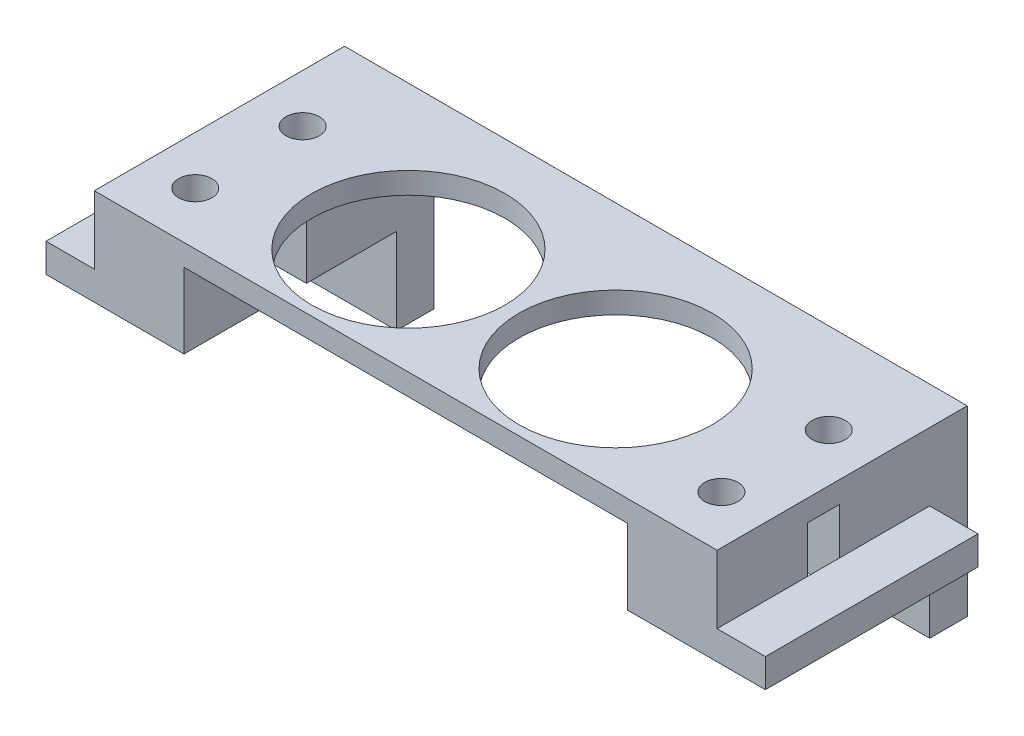
ISO-10303-21;
HEADER;
FILE_DESCRIPTION(('STEP AP214'),'2;1');
FILE_NAME('part.step','',(''),(''),'','','');
FILE_SCHEMA(('AUTOMOTIVE_DESIGN { 1 0 10303 214 1 1 1 1 }'));
ENDSEC;
DATA;
#1=APPLICATION_CONTEXT('core data for automotive mechanical design processes');
#2=APPLICATION_PROTOCOL_DEFINITION('international standard','automotive_design',2000,#1);
#3=PRODUCT_CONTEXT('',#1,'mechanical');
#4=PRODUCT('Part','Part','',(#3));
#5=PRODUCT_RELATED_PRODUCT_CATEGORY('part','',(#4));
#6=PRODUCT_DEFINITION_FORMATION('','',#4);
#7=PRODUCT_DEFINITION_CONTEXT('part definition',#1,'design');
#8=PRODUCT_DEFINITION('design','',#6,#7);
#9=PRODUCT_DEFINITION_SHAPE('','',#8);
#10=(LENGTH_UNIT() NAMED_UNIT(*) SI_UNIT(.MILLI.,.METRE.));
#11=(NAMED_UNIT(*) PLANE_ANGLE_UNIT() SI_UNIT($,.RADIAN.));
#12=(NAMED_UNIT(*) SI_UNIT($,.STERADIAN.) SOLID_ANGLE_UNIT());
#13=UNCERTAINTY_MEASURE_WITH_UNIT(LENGTH_MEASURE(1.E-05),#10,'distance_accuracy_value','');
#14=(GEOMETRIC_REPRESENTATION_CONTEXT(3) GLOBAL_UNCERTAINTY_ASSIGNED_CONTEXT((#13)) GLOBAL_UNIT_ASSIGNED_CONTEXT((#10,
#11,#12)) REPRESENTATION_CONTEXT('',''));
#15=CARTESIAN_POINT('',(0.,0.,0.));
#16=DIRECTION('',(0.,0.,1.));
#17=DIRECTION('',(1.,0.,0.));
#18=AXIS2_PLACEMENT_3D('',#15,#16,#17);
#19=CARTESIAN_POINT('',(-29.,2.,0.));
#20=DIRECTION('',(1.,0.,0.));
#21=DIRECTION('',(0.,0.,-1.));
#22=AXIS2_PLACEMENT_3D('',#19,#20,#21);
#23=PLANE('',#22);
#24=DIRECTION('',(0.,-1.,0.));
#25=VECTOR('',#24,1.);
#26=CARTESIAN_POINT('',(-29.,-4.325,-9.9));
#27=LINE('',#26,#25);
#28=CARTESIAN_POINT('',(-29.,-4.325,-9.9));
#29=VERTEX_POINT('',#28);
#30=CARTESIAN_POINT('',(-29.,-7.,-9.9));
#31=VERTEX_POINT('',#30);
#32=EDGE_CURVE('E248',#29,#31,#27,.T.);
#33=ORIENTED_EDGE('',*,*,#32,.F.);
#34=DIRECTION('',(0.,0.,1.));
#35=VECTOR('',#34,1.);
#36=CARTESIAN_POINT('',(-29.,-4.325,9.9));
#37=LINE('',#36,#35);
#38=CARTESIAN_POINT('',(-29.,-4.325,-1.5));
#39=VERTEX_POINT('',#38);
#40=EDGE_CURVE('E48',#29,#39,#37,.T.);
#41=ORIENTED_EDGE('',*,*,#40,.T.);
#42=DIRECTION('',(0.,1.,0.));
#43=VECTOR('',#42,1.);
#44=CARTESIAN_POINT('',(-29.,-7.,-1.5));
#45=LINE('',#44,#43);
#46=CARTESIAN_POINT('',(-29.,0.,-1.5));
#47=VERTEX_POINT('',#46);
#48=EDGE_CURVE('E398',#39,#47,#45,.T.);
#49=ORIENTED_EDGE('',*,*,#48,.T.);
#50=DIRECTION('',(0.,0.,1.));
#51=VECTOR('',#50,1.);
#52=CARTESIAN_POINT('',(-29.,0.,0.));
#53=LINE('',#52,#51);
#54=CARTESIAN_POINT('',(-29.,0.,1.5));
#55=VERTEX_POINT('',#54);
#56=EDGE_CURVE('E462',#47,#55,#53,.T.);
#57=ORIENTED_EDGE('',*,*,#56,.T.);
#58=DIRECTION('',(0.,1.,0.));
#59=VECTOR('',#58,1.);
#60=CARTESIAN_POINT('',(-29.,-7.,1.5));
#61=LINE('',#60,#59);
#62=CARTESIAN_POINT('',(-29.,-4.325,1.50000000000001));
#63=VERTEX_POINT('',#62);
#64=EDGE_CURVE('E422',#63,#55,#61,.T.);
#65=ORIENTED_EDGE('',*,*,#64,.F.);
#66=CARTESIAN_POINT('',(-29.,-4.325,9.9));
#67=VERTEX_POINT('',#66);
#68=EDGE_CURVE('E11',#63,#67,#37,.T.);
#69=ORIENTED_EDGE('',*,*,#68,.T.);
#70=DIRECTION('',(0.,-1.,0.));
#71=VECTOR('',#70,1.);
#72=CARTESIAN_POINT('',(-29.,2.,9.9));
#73=LINE('',#72,#71);
#74=CARTESIAN_POINT('',(-29.,2.,9.9));
#75=VERTEX_POINT('',#74);
#76=EDGE_CURVE('E41',#75,#67,#73,.T.);
#77=ORIENTED_EDGE('',*,*,#76,.F.);
#78=DIRECTION('',(0.,0.,1.));
#79=VECTOR('',#78,1.);
#80=CARTESIAN_POINT('',(-29.,2.,0.));
#81=LINE('',#80,#79);
#82=CARTESIAN_POINT('',(-29.,2.,-13.4));
#83=VERTEX_POINT('',#82);
#84=EDGE_CURVE('E448',#83,#75,#81,.T.);
#85=ORIENTED_EDGE('',*,*,#84,.F.);
#86=DIRECTION('',(0.,1.,0.));
#87=VECTOR('',#86,1.);
#88=CARTESIAN_POINT('',(-29.,-58.1055074842308,-13.4));
#89=LINE('',#88,#87);
#90=CARTESIAN_POINT('',(-29.,-15.,-13.4));
#91=VERTEX_POINT('',#90);
#92=EDGE_CURVE('E327',#91,#83,#89,.T.);
#93=ORIENTED_EDGE('',*,*,#92,.F.);
#94=DIRECTION('',(0.,0.,-1.));
#95=VECTOR('',#94,1.);
#96=CARTESIAN_POINT('',(-29.,-15.,0.));
#97=LINE('',#96,#95);
#98=CARTESIAN_POINT('',(-29.,-15.,-9.9));
#99=VERTEX_POINT('',#98);
#100=EDGE_CURVE('E290',#99,#91,#97,.T.);
#101=ORIENTED_EDGE('',*,*,#100,.F.);
#102=DIRECTION('',(0.,1.,0.));
#103=VECTOR('',#102,1.);
#104=CARTESIAN_POINT('',(-29.,-15.,-9.9));
#105=LINE('',#104,#103);
#106=EDGE_CURVE('E294',#99,#31,#105,.T.);
#107=ORIENTED_EDGE('',*,*,#106,.T.);
#108=EDGE_LOOP('',(#33,#41,#49,#57,#65,#69,#77,#85,#93,#101,#107));
#109=FACE_BOUND('',#108,.T.);
#110=ADVANCED_FACE('F37',(#109),#23,.F.);
#111=CARTESIAN_POINT('',(29.,2.,0.));
#112=DIRECTION('',(1.,0.,0.));
#113=DIRECTION('',(0.,0.,-1.));
#114=AXIS2_PLACEMENT_3D('',#111,#112,#113);
#115=PLANE('',#114);
#116=DIRECTION('',(0.,-1.,0.));
#117=VECTOR('',#116,1.);
#118=CARTESIAN_POINT('',(29.,2.,9.9));
#119=LINE('',#118,#117);
#120=CARTESIAN_POINT('',(29.,2.,9.9));
#121=VERTEX_POINT('',#120);
#122=CARTESIAN_POINT('',(29.,-4.325,9.9));
#123=VERTEX_POINT('',#122);
#124=EDGE_CURVE('E453',#121,#123,#119,.T.);
#125=ORIENTED_EDGE('',*,*,#124,.T.);
#126=DIRECTION('',(0.,0.,-1.));
#127=VECTOR('',#126,1.);
#128=CARTESIAN_POINT('',(29.,-4.325,9.9));
#129=LINE('',#128,#127);
#130=CARTESIAN_POINT('',(29.,-4.325,1.5));
#131=VERTEX_POINT('',#130);
#132=EDGE_CURVE('E252',#123,#131,#129,.T.);
#133=ORIENTED_EDGE('',*,*,#132,.T.);
#134=DIRECTION('',(0.,1.,0.));
#135=VECTOR('',#134,1.);
#136=CARTESIAN_POINT('',(29.,-7.,1.5));
#137=LINE('',#136,#135);
#138=CARTESIAN_POINT('',(29.,0.,1.5));
#139=VERTEX_POINT('',#138);
#140=EDGE_CURVE('E373',#131,#139,#137,.T.);
#141=ORIENTED_EDGE('',*,*,#140,.T.);
#142=DIRECTION('',(0.,0.,1.));
#143=VECTOR('',#142,1.);
#144=CARTESIAN_POINT('',(29.,0.,0.));
#145=LINE('',#144,#143);
#146=CARTESIAN_POINT('',(29.,0.,-1.5));
#147=VERTEX_POINT('',#146);
#148=EDGE_CURVE('E459',#147,#139,#145,.T.);
#149=ORIENTED_EDGE('',*,*,#148,.F.);
#150=DIRECTION('',(0.,1.,0.));
#151=VECTOR('',#150,1.);
#152=CARTESIAN_POINT('',(29.,-7.,-1.5));
#153=LINE('',#152,#151);
#154=CARTESIAN_POINT('',(29.,-4.325,-1.49999999999999));
#155=VERTEX_POINT('',#154);
#156=EDGE_CURVE('E344',#155,#147,#153,.T.);
#157=ORIENTED_EDGE('',*,*,#156,.F.);
#158=CARTESIAN_POINT('',(29.,-4.325,-9.9));
#159=VERTEX_POINT('',#158);
#160=EDGE_CURVE('E46',#155,#159,#129,.T.);
#161=ORIENTED_EDGE('',*,*,#160,.T.);
#162=DIRECTION('',(0.,-1.,0.));
#163=VECTOR('',#162,1.);
#164=CARTESIAN_POINT('',(29.,-4.325,-9.9));
#165=LINE('',#164,#163);
#166=CARTESIAN_POINT('',(29.,-7.,-9.9));
#167=VERTEX_POINT('',#166);
#168=EDGE_CURVE('E265',#159,#167,#165,.T.);
#169=ORIENTED_EDGE('',*,*,#168,.T.);
#170=DIRECTION('',(0.,1.,0.));
#171=VECTOR('',#170,1.);
#172=CARTESIAN_POINT('',(29.,-15.,-9.9));
#173=LINE('',#172,#171);
#174=CARTESIAN_POINT('',(29.,-15.,-9.9));
#175=VERTEX_POINT('',#174);
#176=EDGE_CURVE('E316',#175,#167,#173,.T.);
#177=ORIENTED_EDGE('',*,*,#176,.F.);
#178=DIRECTION('',(0.,0.,-1.));
#179=VECTOR('',#178,1.);
#180=CARTESIAN_POINT('',(29.,-15.,0.));
#181=LINE('',#180,#179);
#182=CARTESIAN_POINT('',(29.,-15.,-13.4));
#183=VERTEX_POINT('',#182);
#184=EDGE_CURVE('E305',#175,#183,#181,.T.);
#185=ORIENTED_EDGE('',*,*,#184,.T.);
#186=DIRECTION('',(0.,1.,0.));
#187=VECTOR('',#186,1.);
#188=CARTESIAN_POINT('',(29.,-58.1055074842308,-13.4));
#189=LINE('',#188,#187);
#190=CARTESIAN_POINT('',(29.,2.,-13.4));
#191=VERTEX_POINT('',#190);
#192=EDGE_CURVE('E325',#183,#191,#189,.T.);
#193=ORIENTED_EDGE('',*,*,#192,.T.);
#194=DIRECTION('',(0.,0.,1.));
#195=VECTOR('',#194,1.);
#196=CARTESIAN_POINT('',(29.,2.,0.));
#197=LINE('',#196,#195);
#198=EDGE_CURVE('E446',#191,#121,#197,.T.);
#199=ORIENTED_EDGE('',*,*,#198,.T.);
#200=EDGE_LOOP('',(#125,#133,#141,#149,#157,#161,#169,#177,#185,#193,#199));
#201=FACE_BOUND('',#200,.T.);
#202=ADVANCED_FACE('F477',(#201),#115,.T.);
#203=CARTESIAN_POINT('',(0.,0.,0.));
#204=DIRECTION('',(0.,1.,0.));
#205=DIRECTION('',(0.,0.,1.));
#206=AXIS2_PLACEMENT_3D('',#203,#204,#205);
#207=PLANE('',#206);
#208=CARTESIAN_POINT('',(9.65,0.,0.));
#209=DIRECTION('',(0.,1.,0.));
#210=DIRECTION('',(0.,0.,1.));
#211=AXIS2_PLACEMENT_3D('',#208,#209,#210);
#212=CIRCLE('',#211,9.);
#213=CARTESIAN_POINT('',(9.65,0.,9.));
#214=VERTEX_POINT('',#213);
#215=EDGE_CURVE('E426',#214,#214,#212,.T.);
#216=ORIENTED_EDGE('',*,*,#215,.T.);
#217=EDGE_LOOP('',(#216));
#218=FACE_BOUND('',#217,.T.);
#219=CARTESIAN_POINT('',(-9.65,0.,0.));
#220=DIRECTION('',(0.,1.,0.));
#221=DIRECTION('',(0.,0.,1.));
#222=AXIS2_PLACEMENT_3D('',#219,#220,#221);
#223=CIRCLE('',#222,9.);
#224=CARTESIAN_POINT('',(-9.65,0.,9.));
#225=VERTEX_POINT('',#224);
#226=EDGE_CURVE('E456',#225,#225,#223,.T.);
#227=ORIENTED_EDGE('',*,*,#226,.T.);
#228=EDGE_LOOP('',(#227));
#229=FACE_BOUND('',#228,.T.);
#230=DIRECTION('',(0.,0.,-1.));
#231=VECTOR('',#230,1.);
#232=CARTESIAN_POINT('',(-20.65,0.,0.));
#233=LINE('',#232,#231);
#234=CARTESIAN_POINT('',(-20.65,0.,-1.5));
#235=VERTEX_POINT('',#234);
#236=CARTESIAN_POINT('',(-20.65,0.,-13.4));
#237=VERTEX_POINT('',#236);
#238=EDGE_CURVE('E384',#235,#237,#233,.T.);
#239=ORIENTED_EDGE('',*,*,#238,.T.);
#240=DIRECTION('',(1.,0.,0.));
#241=VECTOR('',#240,1.);
#242=CARTESIAN_POINT('',(0.,0.,-13.4));
#243=LINE('',#242,#241);
#244=CARTESIAN_POINT('',(20.65,0.,-13.4));
#245=VERTEX_POINT('',#244);
#246=EDGE_CURVE('E321',#237,#245,#243,.T.);
#247=ORIENTED_EDGE('',*,*,#246,.T.);
#248=DIRECTION('',(0.,0.,-1.));
#249=VECTOR('',#248,1.);
#250=CARTESIAN_POINT('',(20.65,0.,0.));
#251=LINE('',#250,#249);
#252=CARTESIAN_POINT('',(20.65,0.,-1.5));
#253=VERTEX_POINT('',#252);
#254=EDGE_CURVE('E335',#253,#245,#251,.T.);
#255=ORIENTED_EDGE('',*,*,#254,.F.);
#256=DIRECTION('',(1.,0.,0.));
#257=VECTOR('',#256,1.);
#258=CARTESIAN_POINT('',(0.,0.,-1.5));
#259=LINE('',#258,#257);
#260=EDGE_CURVE('E324',#253,#147,#259,.T.);
#261=ORIENTED_EDGE('',*,*,#260,.T.);
#262=ORIENTED_EDGE('',*,*,#148,.T.);
#263=DIRECTION('',(1.,0.,0.));
#264=VECTOR('',#263,1.);
#265=CARTESIAN_POINT('',(0.,0.,1.5));
#266=LINE('',#265,#264);
#267=CARTESIAN_POINT('',(20.65,0.,1.5));
#268=VERTEX_POINT('',#267);
#269=EDGE_CURVE('E359',#268,#139,#266,.T.);
#270=ORIENTED_EDGE('',*,*,#269,.F.);
#271=DIRECTION('',(0.,0.,-1.));
#272=VECTOR('',#271,1.);
#273=CARTESIAN_POINT('',(20.65,0.,0.));
#274=LINE('',#273,#272);
#275=CARTESIAN_POINT('',(20.65,0.,9.9));
#276=VERTEX_POINT('',#275);
#277=EDGE_CURVE('E354',#276,#268,#274,.T.);
#278=ORIENTED_EDGE('',*,*,#277,.F.);
#279=DIRECTION('',(1.,0.,0.));
#280=VECTOR('',#279,1.);
#281=CARTESIAN_POINT('',(0.,0.,9.9));
#282=LINE('',#281,#280);
#283=CARTESIAN_POINT('',(-20.65,0.,9.9));
#284=VERTEX_POINT('',#283);
#285=EDGE_CURVE('E431',#284,#276,#282,.T.);
#286=ORIENTED_EDGE('',*,*,#285,.F.);
#287=DIRECTION('',(0.,0.,-1.));
#288=VECTOR('',#287,1.);
#289=CARTESIAN_POINT('',(-20.65,0.,0.));
#290=LINE('',#289,#288);
#291=CARTESIAN_POINT('',(-20.65,0.,1.5));
#292=VERTEX_POINT('',#291);
#293=EDGE_CURVE('E406',#284,#292,#290,.T.);
#294=ORIENTED_EDGE('',*,*,#293,.T.);
#295=DIRECTION('',(1.,0.,0.));
#296=VECTOR('',#295,1.);
#297=CARTESIAN_POINT('',(0.,0.,1.5));
#298=LINE('',#297,#296);
#299=EDGE_CURVE('E401',#55,#292,#298,.T.);
#300=ORIENTED_EDGE('',*,*,#299,.F.);
#301=ORIENTED_EDGE('',*,*,#56,.F.);
#302=DIRECTION('',(1.,0.,0.));
#303=VECTOR('',#302,1.);
#304=CARTESIAN_POINT('',(0.,0.,-1.5));
#305=LINE('',#304,#303);
#306=EDGE_CURVE('E379',#47,#235,#305,.T.);
#307=ORIENTED_EDGE('',*,*,#306,.T.);
#308=EDGE_LOOP('',(#239,#247,#255,#261,#262,#270,#278,#286,#294,#300,#301,#307));
#309=FACE_BOUND('',#308,.T.);
#310=ADVANCED_FACE('F493',(#218,#229,#309),#207,.F.);
#311=CARTESIAN_POINT('',(-9.65,2.,0.));
#312=DIRECTION('',(0.,-1.,0.));
#313=DIRECTION('',(0.,0.,-1.));
#314=AXIS2_PLACEMENT_3D('',#311,#312,#313);
#315=CYLINDRICAL_SURFACE('',#314,9.);
#316=CARTESIAN_POINT('',(-9.65,2.,0.));
#317=DIRECTION('',(0.,1.,0.));
#318=DIRECTION('',(0.,0.,1.));
#319=AXIS2_PLACEMENT_3D('',#316,#317,#318);
#320=CIRCLE('',#319,9.);
#321=CARTESIAN_POINT('',(-9.65,2.,9.));
#322=VERTEX_POINT('',#321);
#323=EDGE_CURVE('E443',#322,#322,#320,.T.);
#324=ORIENTED_EDGE('',*,*,#323,.T.);
#325=EDGE_LOOP('',(#324));
#326=FACE_BOUND('',#325,.T.);
#327=ORIENTED_EDGE('',*,*,#226,.F.);
#328=EDGE_LOOP('',(#327));
#329=FACE_BOUND('',#328,.T.);
#330=ADVANCED_FACE('F546',(#326,#329),#315,.F.);
#331=CARTESIAN_POINT('',(-24.5,2.,-5.));
#332=DIRECTION('',(0.,-1.,0.));
#333=DIRECTION('',(0.,0.,-1.));
#334=AXIS2_PLACEMENT_3D('',#331,#332,#333);
#335=CYLINDRICAL_SURFACE('',#334,1.55);
#336=CARTESIAN_POINT('',(-24.5,2.,-5.));
#337=DIRECTION('',(0.,1.,0.));
#338=DIRECTION('',(0.,0.,1.));
#339=AXIS2_PLACEMENT_3D('',#336,#337,#338);
#340=CIRCLE('',#339,1.55);
#341=CARTESIAN_POINT('',(-24.5,2.,-3.45));
#342=VERTEX_POINT('',#341);
#343=EDGE_CURVE('E440',#342,#342,#340,.T.);
#344=ORIENTED_EDGE('',*,*,#343,.T.);
#345=EDGE_LOOP('',(#344));
#346=FACE_BOUND('',#345,.T.);
#347=CARTESIAN_POINT('',(-24.5,-7.,-5.));
#348=DIRECTION('',(0.,-1.,0.));
#349=DIRECTION('',(0.,0.,-1.));
#350=AXIS2_PLACEMENT_3D('',#347,#348,#349);
#351=CIRCLE('',#350,1.55);
#352=CARTESIAN_POINT('',(-24.5,-7.,-6.55));
#353=VERTEX_POINT('',#352);
#354=EDGE_CURVE('E390',#353,#353,#351,.F.);
#355=ORIENTED_EDGE('',*,*,#354,.F.);
#356=EDGE_LOOP('',(#355));
#357=FACE_BOUND('',#356,.T.);
#358=ADVANCED_FACE('F549',(#346,#357),#335,.F.);
#359=CARTESIAN_POINT('',(-24.5,2.,5.));
#360=DIRECTION('',(0.,-1.,0.));
#361=DIRECTION('',(0.,0.,-1.));
#362=AXIS2_PLACEMENT_3D('',#359,#360,#361);
#363=CYLINDRICAL_SURFACE('',#362,1.55);
#364=CARTESIAN_POINT('',(-24.5,2.,5.));
#365=DIRECTION('',(0.,1.,0.));
#366=DIRECTION('',(0.,0.,1.));
#367=AXIS2_PLACEMENT_3D('',#364,#365,#366);
#368=CIRCLE('',#367,1.55);
#369=CARTESIAN_POINT('',(-24.5,2.,6.55));
#370=VERTEX_POINT('',#369);
#371=EDGE_CURVE('E437',#370,#370,#368,.T.);
#372=ORIENTED_EDGE('',*,*,#371,.T.);
#373=EDGE_LOOP('',(#372));
#374=FACE_BOUND('',#373,.T.);
#375=CARTESIAN_POINT('',(-24.5,-7.,5.));
#376=DIRECTION('',(0.,-1.,0.));
#377=DIRECTION('',(0.,0.,-1.));
#378=AXIS2_PLACEMENT_3D('',#375,#376,#377);
#379=CIRCLE('',#378,1.55);
#380=CARTESIAN_POINT('',(-24.5,-7.,3.45));
#381=VERTEX_POINT('',#380);
#382=EDGE_CURVE('E402',#381,#381,#379,.F.);
#383=ORIENTED_EDGE('',*,*,#382,.F.);
#384=EDGE_LOOP('',(#383));
#385=FACE_BOUND('',#384,.T.);
#386=ADVANCED_FACE('F553',(#374,#385),#363,.F.);
#387=CARTESIAN_POINT('',(24.5,2.,-5.00000000000001));
#388=DIRECTION('',(0.,-1.,0.));
#389=DIRECTION('',(0.,0.,-1.));
#390=AXIS2_PLACEMENT_3D('',#387,#388,#389);
#391=CYLINDRICAL_SURFACE('',#390,1.55);
#392=CARTESIAN_POINT('',(24.5,2.,-5.00000000000001));
#393=DIRECTION('',(0.,1.,0.));
#394=DIRECTION('',(0.,0.,1.));
#395=AXIS2_PLACEMENT_3D('',#392,#393,#394);
#396=CIRCLE('',#395,1.55);
#397=CARTESIAN_POINT('',(24.5,2.,-3.45000000000001));
#398=VERTEX_POINT('',#397);
#399=EDGE_CURVE('E434',#398,#398,#396,.T.);
#400=ORIENTED_EDGE('',*,*,#399,.T.);
#401=EDGE_LOOP('',(#400));
#402=FACE_BOUND('',#401,.T.);
#403=CARTESIAN_POINT('',(24.5,-7.,-5.00000000000001));
#404=DIRECTION('',(0.,-1.,0.));
#405=DIRECTION('',(0.,0.,-1.));
#406=AXIS2_PLACEMENT_3D('',#403,#404,#405);
#407=CIRCLE('',#406,1.55);
#408=CARTESIAN_POINT('',(24.5,-7.,-6.55000000000001));
#409=VERTEX_POINT('',#408);
#410=EDGE_CURVE('E341',#409,#409,#407,.F.);
#411=ORIENTED_EDGE('',*,*,#410,.F.);
#412=EDGE_LOOP('',(#411));
#413=FACE_BOUND('',#412,.T.);
#414=ADVANCED_FACE('F557',(#402,#413),#391,.F.);
#415=CARTESIAN_POINT('',(24.5,2.,5.00000000000001));
#416=DIRECTION('',(0.,-1.,0.));
#417=DIRECTION('',(0.,0.,-1.));
#418=AXIS2_PLACEMENT_3D('',#415,#416,#417);
#419=CYLINDRICAL_SURFACE('',#418,1.55);
#420=CARTESIAN_POINT('',(24.5,2.,5.00000000000001));
#421=DIRECTION('',(0.,1.,0.));
#422=DIRECTION('',(0.,0.,1.));
#423=AXIS2_PLACEMENT_3D('',#420,#421,#422);
#424=CIRCLE('',#423,1.55);
#425=CARTESIAN_POINT('',(24.5,2.,6.55000000000001));
#426=VERTEX_POINT('',#425);
#427=EDGE_CURVE('E430',#426,#426,#424,.T.);
#428=ORIENTED_EDGE('',*,*,#427,.T.);
#429=EDGE_LOOP('',(#428));
#430=FACE_BOUND('',#429,.T.);
#431=CARTESIAN_POINT('',(24.5,-7.,5.00000000000001));
#432=DIRECTION('',(0.,-1.,0.));
#433=DIRECTION('',(0.,0.,-1.));
#434=AXIS2_PLACEMENT_3D('',#431,#432,#433);
#435=CIRCLE('',#434,1.55);
#436=CARTESIAN_POINT('',(24.5,-7.,3.45000000000001));
#437=VERTEX_POINT('',#436);
#438=EDGE_CURVE('E355',#437,#437,#435,.F.);
#439=ORIENTED_EDGE('',*,*,#438,.F.);
#440=EDGE_LOOP('',(#439));
#441=FACE_BOUND('',#440,.T.);
#442=ADVANCED_FACE('F560',(#430,#441),#419,.F.);
#443=CARTESIAN_POINT('',(9.65,2.,0.));
#444=DIRECTION('',(0.,-1.,0.));
#445=DIRECTION('',(0.,0.,-1.));
#446=AXIS2_PLACEMENT_3D('',#443,#444,#445);
#447=CYLINDRICAL_SURFACE('',#446,9.);
#448=CARTESIAN_POINT('',(9.65,2.,0.));
#449=DIRECTION('',(0.,1.,0.));
#450=DIRECTION('',(0.,0.,1.));
#451=AXIS2_PLACEMENT_3D('',#448,#449,#450);
#452=CIRCLE('',#451,9.);
#453=CARTESIAN_POINT('',(9.65,2.,9.));
#454=VERTEX_POINT('',#453);
#455=EDGE_CURVE('E427',#454,#454,#452,.T.);
#456=ORIENTED_EDGE('',*,*,#455,.T.);
#457=EDGE_LOOP('',(#456));
#458=FACE_BOUND('',#457,.T.);
#459=ORIENTED_EDGE('',*,*,#215,.F.);
#460=EDGE_LOOP('',(#459));
#461=FACE_BOUND('',#460,.T.);
#462=ADVANCED_FACE('F39',(#458,#461),#447,.F.);
#463=CARTESIAN_POINT('',(0.,2.,9.9));
#464=DIRECTION('',(0.,0.,-1.));
#465=DIRECTION('',(-1.,0.,0.));
#466=AXIS2_PLACEMENT_3D('',#463,#464,#465);
#467=PLANE('',#466);
#468=ORIENTED_EDGE('',*,*,#76,.T.);
#469=DIRECTION('',(-1.,0.,0.));
#470=VECTOR('',#469,1.);
#471=CARTESIAN_POINT('',(-29.,-4.325,9.9));
#472=LINE('',#471,#470);
#473=CARTESIAN_POINT('',(-33.5,-4.325,9.9));
#474=VERTEX_POINT('',#473);
#475=EDGE_CURVE('E56',#67,#474,#472,.T.);
#476=ORIENTED_EDGE('',*,*,#475,.T.);
#477=DIRECTION('',(0.,-1.,0.));
#478=VECTOR('',#477,1.);
#479=CARTESIAN_POINT('',(-33.5,-4.325,9.9));
#480=LINE('',#479,#478);
#481=CARTESIAN_POINT('',(-33.5,-7.,9.9));
#482=VERTEX_POINT('',#481);
#483=EDGE_CURVE('E219',#474,#482,#480,.T.);
#484=ORIENTED_EDGE('',*,*,#483,.T.);
#485=DIRECTION('',(-1.,0.,0.));
#486=VECTOR('',#485,1.);
#487=CARTESIAN_POINT('',(0.,-7.,9.9));
#488=LINE('',#487,#486);
#489=CARTESIAN_POINT('',(-20.65,-7.,9.9));
#490=VERTEX_POINT('',#489);
#491=EDGE_CURVE('E411',#490,#482,#488,.T.);
#492=ORIENTED_EDGE('',*,*,#491,.F.);
#493=DIRECTION('',(0.,1.,0.));
#494=VECTOR('',#493,1.);
#495=CARTESIAN_POINT('',(-20.65,-7.,9.9));
#496=LINE('',#495,#494);
#497=EDGE_CURVE('E413',#490,#284,#496,.T.);
#498=ORIENTED_EDGE('',*,*,#497,.T.);
#499=ORIENTED_EDGE('',*,*,#285,.T.);
#500=DIRECTION('',(0.,1.,0.));
#501=VECTOR('',#500,1.);
#502=CARTESIAN_POINT('',(20.65,-7.,9.9));
#503=LINE('',#502,#501);
#504=CARTESIAN_POINT('',(20.65,-7.,9.9));
#505=VERTEX_POINT('',#504);
#506=EDGE_CURVE('E367',#505,#276,#503,.T.);
#507=ORIENTED_EDGE('',*,*,#506,.F.);
#508=DIRECTION('',(-1.,0.,0.));
#509=VECTOR('',#508,1.);
#510=CARTESIAN_POINT('',(0.,-7.,9.9));
#511=LINE('',#510,#509);
#512=CARTESIAN_POINT('',(33.5,-7.,9.9));
#513=VERTEX_POINT('',#512);
#514=EDGE_CURVE('E365',#513,#505,#511,.T.);
#515=ORIENTED_EDGE('',*,*,#514,.F.);
#516=DIRECTION('',(0.,-1.,0.));
#517=VECTOR('',#516,1.);
#518=CARTESIAN_POINT('',(33.5,-4.325,9.9));
#519=LINE('',#518,#517);
#520=CARTESIAN_POINT('',(33.5,-4.325,9.9));
#521=VERTEX_POINT('',#520);
#522=EDGE_CURVE('E274',#521,#513,#519,.T.);
#523=ORIENTED_EDGE('',*,*,#522,.F.);
#524=DIRECTION('',(-1.,0.,0.));
#525=VECTOR('',#524,1.);
#526=CARTESIAN_POINT('',(29.,-4.325,9.9));
#527=LINE('',#526,#525);
#528=EDGE_CURVE('E262',#521,#123,#527,.T.);
#529=ORIENTED_EDGE('',*,*,#528,.T.);
#530=ORIENTED_EDGE('',*,*,#124,.F.);
#531=DIRECTION('',(1.,0.,0.));
#532=VECTOR('',#531,1.);
#533=CARTESIAN_POINT('',(0.,2.,9.9));
#534=LINE('',#533,#532);
#535=EDGE_CURVE('E450',#75,#121,#534,.T.);
#536=ORIENTED_EDGE('',*,*,#535,.F.);
#537=EDGE_LOOP('',(#468,#476,#484,#492,#498,#499,#507,#515,#523,#529,#530,#536));
#538=FACE_BOUND('',#537,.T.);
#539=ADVANCED_FACE('F234',(#538),#467,.F.);
#540=CARTESIAN_POINT('',(0.,2.,0.));
#541=DIRECTION('',(0.,1.,0.));
#542=DIRECTION('',(0.,0.,1.));
#543=AXIS2_PLACEMENT_3D('',#540,#541,#542);
#544=PLANE('',#543);
#545=DIRECTION('',(-1.,0.,0.));
#546=VECTOR('',#545,1.);
#547=CARTESIAN_POINT('',(0.,2.,-13.4));
#548=LINE('',#547,#546);
#549=EDGE_CURVE('E315',#191,#83,#548,.T.);
#550=ORIENTED_EDGE('',*,*,#549,.T.);
#551=ORIENTED_EDGE('',*,*,#84,.T.);
#552=ORIENTED_EDGE('',*,*,#535,.T.);
#553=ORIENTED_EDGE('',*,*,#198,.F.);
#554=EDGE_LOOP('',(#550,#551,#552,#553));
#555=FACE_BOUND('',#554,.T.);
#556=ORIENTED_EDGE('',*,*,#455,.F.);
#557=EDGE_LOOP('',(#556));
#558=FACE_BOUND('',#557,.T.);
#559=ORIENTED_EDGE('',*,*,#427,.F.);
#560=EDGE_LOOP('',(#559));
#561=FACE_BOUND('',#560,.T.);
#562=ORIENTED_EDGE('',*,*,#399,.F.);
#563=EDGE_LOOP('',(#562));
#564=FACE_BOUND('',#563,.T.);
#565=ORIENTED_EDGE('',*,*,#371,.F.);
#566=EDGE_LOOP('',(#565));
#567=FACE_BOUND('',#566,.T.);
#568=ORIENTED_EDGE('',*,*,#343,.F.);
#569=EDGE_LOOP('',(#568));
#570=FACE_BOUND('',#569,.T.);
#571=ORIENTED_EDGE('',*,*,#323,.F.);
#572=EDGE_LOOP('',(#571));
#573=FACE_BOUND('',#572,.T.);
#574=ADVANCED_FACE('F518',(#555,#558,#561,#564,#567,#570,#573),#544,.T.);
#575=CARTESIAN_POINT('',(0.,-7.,1.5));
#576=DIRECTION('',(0.,0.,1.));
#577=DIRECTION('',(1.,0.,0.));
#578=AXIS2_PLACEMENT_3D('',#575,#576,#577);
#579=PLANE('',#578);
#580=ORIENTED_EDGE('',*,*,#299,.T.);
#581=DIRECTION('',(0.,1.,0.));
#582=VECTOR('',#581,1.);
#583=CARTESIAN_POINT('',(-20.65,-7.,1.5));
#584=LINE('',#583,#582);
#585=CARTESIAN_POINT('',(-20.65,-7.,1.5));
#586=VERTEX_POINT('',#585);
#587=EDGE_CURVE('E419',#586,#292,#584,.T.);
#588=ORIENTED_EDGE('',*,*,#587,.F.);
#589=DIRECTION('',(1.,0.,0.));
#590=VECTOR('',#589,1.);
#591=CARTESIAN_POINT('',(0.,-7.,1.5));
#592=LINE('',#591,#590);
#593=CARTESIAN_POINT('',(-29.,-7.,1.5));
#594=VERTEX_POINT('',#593);
#595=EDGE_CURVE('E405',#594,#586,#592,.T.);
#596=ORIENTED_EDGE('',*,*,#595,.F.);
#597=EDGE_CURVE('E423',#594,#63,#61,.T.);
#598=ORIENTED_EDGE('',*,*,#597,.T.);
#599=ORIENTED_EDGE('',*,*,#64,.T.);
#600=EDGE_LOOP('',(#580,#588,#596,#598,#599));
#601=FACE_BOUND('',#600,.T.);
#602=ADVANCED_FACE('F601',(#601),#579,.F.);
#603=CARTESIAN_POINT('',(-20.65,-7.,0.));
#604=DIRECTION('',(1.,0.,0.));
#605=DIRECTION('',(0.,0.,-1.));
#606=AXIS2_PLACEMENT_3D('',#603,#604,#605);
#607=PLANE('',#606);
#608=ORIENTED_EDGE('',*,*,#293,.F.);
#609=ORIENTED_EDGE('',*,*,#497,.F.);
#610=DIRECTION('',(0.,0.,-1.));
#611=VECTOR('',#610,1.);
#612=CARTESIAN_POINT('',(-20.65,-7.,0.));
#613=LINE('',#612,#611);
#614=EDGE_CURVE('E408',#490,#586,#613,.T.);
#615=ORIENTED_EDGE('',*,*,#614,.T.);
#616=ORIENTED_EDGE('',*,*,#587,.T.);
#617=EDGE_LOOP('',(#608,#609,#615,#616));
#618=FACE_BOUND('',#617,.T.);
#619=ADVANCED_FACE('F597',(#618),#607,.T.);
#620=CARTESIAN_POINT('',(0.,-7.,0.));
#621=DIRECTION('',(0.,-1.,0.));
#622=DIRECTION('',(0.,0.,-1.));
#623=AXIS2_PLACEMENT_3D('',#620,#621,#622);
#624=PLANE('',#623);
#625=ORIENTED_EDGE('',*,*,#382,.T.);
#626=EDGE_LOOP('',(#625));
#627=FACE_BOUND('',#626,.T.);
#628=ORIENTED_EDGE('',*,*,#491,.T.);
#629=DIRECTION('',(0.,0.,-1.));
#630=VECTOR('',#629,1.);
#631=CARTESIAN_POINT('',(-33.5,-7.,9.9));
#632=LINE('',#631,#630);
#633=CARTESIAN_POINT('',(-33.5,-7.,-9.9));
#634=VERTEX_POINT('',#633);
#635=EDGE_CURVE('E224',#482,#634,#632,.T.);
#636=ORIENTED_EDGE('',*,*,#635,.T.);
#637=DIRECTION('',(1.,0.,0.));
#638=VECTOR('',#637,1.);
#639=CARTESIAN_POINT('',(-29.,-7.,-9.9));
#640=LINE('',#639,#638);
#641=EDGE_CURVE('E245',#634,#31,#640,.T.);
#642=ORIENTED_EDGE('',*,*,#641,.T.);
#643=DIRECTION('',(1.,0.,0.));
#644=VECTOR('',#643,1.);
#645=CARTESIAN_POINT('',(0.,-7.,-9.9));
#646=LINE('',#645,#644);
#647=CARTESIAN_POINT('',(-20.65,-7.,-9.9));
#648=VERTEX_POINT('',#647);
#649=EDGE_CURVE('E383',#31,#648,#646,.T.);
#650=ORIENTED_EDGE('',*,*,#649,.T.);
#651=DIRECTION('',(0.,0.,-1.));
#652=VECTOR('',#651,1.);
#653=CARTESIAN_POINT('',(-20.65,-7.,0.));
#654=LINE('',#653,#652);
#655=CARTESIAN_POINT('',(-20.65,-7.,-1.5));
#656=VERTEX_POINT('',#655);
#657=EDGE_CURVE('E387',#656,#648,#654,.T.);
#658=ORIENTED_EDGE('',*,*,#657,.F.);
#659=DIRECTION('',(1.,0.,0.));
#660=VECTOR('',#659,1.);
#661=CARTESIAN_POINT('',(0.,-7.,-1.5));
#662=LINE('',#661,#660);
#663=CARTESIAN_POINT('',(-29.,-7.,-1.5));
#664=VERTEX_POINT('',#663);
#665=EDGE_CURVE('E380',#664,#656,#662,.T.);
#666=ORIENTED_EDGE('',*,*,#665,.F.);
#667=DIRECTION('',(0.,0.,1.));
#668=VECTOR('',#667,1.);
#669=CARTESIAN_POINT('',(-29.,-7.,9.9));
#670=LINE('',#669,#668);
#671=EDGE_CURVE('E241',#664,#594,#670,.T.);
#672=ORIENTED_EDGE('',*,*,#671,.T.);
#673=ORIENTED_EDGE('',*,*,#595,.T.);
#674=ORIENTED_EDGE('',*,*,#614,.F.);
#675=EDGE_LOOP('',(#628,#636,#642,#650,#658,#666,#672,#673,#674));
#676=FACE_BOUND('',#675,.T.);
#677=ORIENTED_EDGE('',*,*,#354,.T.);
#678=EDGE_LOOP('',(#677));
#679=FACE_BOUND('',#678,.T.);
#680=ADVANCED_FACE('F593',(#627,#676,#679),#624,.T.);
#681=CARTESIAN_POINT('',(0.,-7.,-1.5));
#682=DIRECTION('',(0.,0.,1.));
#683=DIRECTION('',(1.,0.,0.));
#684=AXIS2_PLACEMENT_3D('',#681,#682,#683);
#685=PLANE('',#684);
#686=ORIENTED_EDGE('',*,*,#306,.F.);
#687=ORIENTED_EDGE('',*,*,#48,.F.);
#688=EDGE_CURVE('E399',#664,#39,#45,.T.);
#689=ORIENTED_EDGE('',*,*,#688,.F.);
#690=ORIENTED_EDGE('',*,*,#665,.T.);
#691=DIRECTION('',(0.,1.,0.));
#692=VECTOR('',#691,1.);
#693=CARTESIAN_POINT('',(-20.65,-7.,-1.5));
#694=LINE('',#693,#692);
#695=EDGE_CURVE('E393',#656,#235,#694,.T.);
#696=ORIENTED_EDGE('',*,*,#695,.T.);
#697=EDGE_LOOP('',(#686,#687,#689,#690,#696));
#698=FACE_BOUND('',#697,.T.);
#699=ADVANCED_FACE('F589',(#698),#685,.T.);
#700=CARTESIAN_POINT('',(-20.65,-7.,0.));
#701=DIRECTION('',(1.,0.,0.));
#702=DIRECTION('',(0.,0.,-1.));
#703=AXIS2_PLACEMENT_3D('',#700,#701,#702);
#704=PLANE('',#703);
#705=DIRECTION('',(0.,1.,0.));
#706=VECTOR('',#705,1.);
#707=CARTESIAN_POINT('',(-20.65,-15.,-13.4));
#708=LINE('',#707,#706);
#709=CARTESIAN_POINT('',(-20.65,-15.,-13.4));
#710=VERTEX_POINT('',#709);
#711=EDGE_CURVE('E298',#710,#237,#708,.T.);
#712=ORIENTED_EDGE('',*,*,#711,.T.);
#713=ORIENTED_EDGE('',*,*,#238,.F.);
#714=ORIENTED_EDGE('',*,*,#695,.F.);
#715=ORIENTED_EDGE('',*,*,#657,.T.);
#716=DIRECTION('',(0.,1.,0.));
#717=VECTOR('',#716,1.);
#718=CARTESIAN_POINT('',(-20.65,-15.,-9.9));
#719=LINE('',#718,#717);
#720=CARTESIAN_POINT('',(-20.65,-15.,-9.9));
#721=VERTEX_POINT('',#720);
#722=EDGE_CURVE('E293',#721,#648,#719,.T.);
#723=ORIENTED_EDGE('',*,*,#722,.F.);
#724=DIRECTION('',(0.,0.,-1.));
#725=VECTOR('',#724,1.);
#726=CARTESIAN_POINT('',(-20.65,-15.,0.));
#727=LINE('',#726,#725);
#728=EDGE_CURVE('E284',#721,#710,#727,.T.);
#729=ORIENTED_EDGE('',*,*,#728,.T.);
#730=EDGE_LOOP('',(#712,#713,#714,#715,#723,#729));
#731=FACE_BOUND('',#730,.T.);
#732=ADVANCED_FACE('F585',(#731),#704,.T.);
#733=CARTESIAN_POINT('',(20.65,-7.,0.));
#734=DIRECTION('',(1.,0.,0.));
#735=DIRECTION('',(0.,0.,-1.));
#736=AXIS2_PLACEMENT_3D('',#733,#734,#735);
#737=PLANE('',#736);
#738=ORIENTED_EDGE('',*,*,#277,.T.);
#739=DIRECTION('',(0.,1.,0.));
#740=VECTOR('',#739,1.);
#741=CARTESIAN_POINT('',(20.65,-7.,1.5));
#742=LINE('',#741,#740);
#743=CARTESIAN_POINT('',(20.65,-7.,1.5));
#744=VERTEX_POINT('',#743);
#745=EDGE_CURVE('E377',#744,#268,#742,.T.);
#746=ORIENTED_EDGE('',*,*,#745,.F.);
#747=DIRECTION('',(0.,0.,-1.));
#748=VECTOR('',#747,1.);
#749=CARTESIAN_POINT('',(20.65,-7.,0.));
#750=LINE('',#749,#748);
#751=EDGE_CURVE('E358',#505,#744,#750,.T.);
#752=ORIENTED_EDGE('',*,*,#751,.F.);
#753=ORIENTED_EDGE('',*,*,#506,.T.);
#754=EDGE_LOOP('',(#738,#746,#752,#753));
#755=FACE_BOUND('',#754,.T.);
#756=ADVANCED_FACE('F579',(#755),#737,.F.);
#757=CARTESIAN_POINT('',(0.,-7.,1.5));
#758=DIRECTION('',(0.,0.,1.));
#759=DIRECTION('',(1.,0.,0.));
#760=AXIS2_PLACEMENT_3D('',#757,#758,#759);
#761=PLANE('',#760);
#762=ORIENTED_EDGE('',*,*,#269,.T.);
#763=ORIENTED_EDGE('',*,*,#140,.F.);
#764=CARTESIAN_POINT('',(29.,-7.,1.5));
#765=VERTEX_POINT('',#764);
#766=EDGE_CURVE('E374',#765,#131,#137,.T.);
#767=ORIENTED_EDGE('',*,*,#766,.F.);
#768=DIRECTION('',(1.,0.,0.));
#769=VECTOR('',#768,1.);
#770=CARTESIAN_POINT('',(0.,-7.,1.5));
#771=LINE('',#770,#769);
#772=EDGE_CURVE('E362',#744,#765,#771,.T.);
#773=ORIENTED_EDGE('',*,*,#772,.F.);
#774=ORIENTED_EDGE('',*,*,#745,.T.);
#775=EDGE_LOOP('',(#762,#763,#767,#773,#774));
#776=FACE_BOUND('',#775,.T.);
#777=ADVANCED_FACE('F490',(#776),#761,.F.);
#778=CARTESIAN_POINT('',(0.,-7.,0.));
#779=DIRECTION('',(0.,-1.,0.));
#780=DIRECTION('',(0.,0.,-1.));
#781=AXIS2_PLACEMENT_3D('',#778,#779,#780);
#782=PLANE('',#781);
#783=ORIENTED_EDGE('',*,*,#438,.T.);
#784=EDGE_LOOP('',(#783));
#785=FACE_BOUND('',#784,.T.);
#786=ORIENTED_EDGE('',*,*,#751,.T.);
#787=ORIENTED_EDGE('',*,*,#772,.T.);
#788=DIRECTION('',(0.,0.,-1.));
#789=VECTOR('',#788,1.);
#790=CARTESIAN_POINT('',(29.,-7.,9.9));
#791=LINE('',#790,#789);
#792=CARTESIAN_POINT('',(29.,-7.,-1.5));
#793=VERTEX_POINT('',#792);
#794=EDGE_CURVE('E250',#765,#793,#791,.T.);
#795=ORIENTED_EDGE('',*,*,#794,.T.);
#796=DIRECTION('',(1.,0.,0.));
#797=VECTOR('',#796,1.);
#798=CARTESIAN_POINT('',(0.,-7.,-1.5));
#799=LINE('',#798,#797);
#800=CARTESIAN_POINT('',(20.65,-7.,-1.5));
#801=VERTEX_POINT('',#800);
#802=EDGE_CURVE('E331',#801,#793,#799,.T.);
#803=ORIENTED_EDGE('',*,*,#802,.F.);
#804=DIRECTION('',(0.,0.,-1.));
#805=VECTOR('',#804,1.);
#806=CARTESIAN_POINT('',(20.65,-7.,0.));
#807=LINE('',#806,#805);
#808=CARTESIAN_POINT('',(20.65,-7.,-9.9));
#809=VERTEX_POINT('',#808);
#810=EDGE_CURVE('E334',#801,#809,#807,.T.);
#811=ORIENTED_EDGE('',*,*,#810,.T.);
#812=DIRECTION('',(1.,0.,0.));
#813=VECTOR('',#812,1.);
#814=CARTESIAN_POINT('',(0.,-7.,-9.9));
#815=LINE('',#814,#813);
#816=EDGE_CURVE('E338',#809,#167,#815,.T.);
#817=ORIENTED_EDGE('',*,*,#816,.T.);
#818=DIRECTION('',(1.,0.,0.));
#819=VECTOR('',#818,1.);
#820=CARTESIAN_POINT('',(29.,-7.,-9.9));
#821=LINE('',#820,#819);
#822=CARTESIAN_POINT('',(33.5,-7.,-9.9));
#823=VERTEX_POINT('',#822);
#824=EDGE_CURVE('E268',#167,#823,#821,.T.);
#825=ORIENTED_EDGE('',*,*,#824,.T.);
#826=DIRECTION('',(0.,0.,1.));
#827=VECTOR('',#826,1.);
#828=CARTESIAN_POINT('',(33.5,-7.,9.9));
#829=LINE('',#828,#827);
#830=EDGE_CURVE('E271',#823,#513,#829,.T.);
#831=ORIENTED_EDGE('',*,*,#830,.T.);
#832=ORIENTED_EDGE('',*,*,#514,.T.);
#833=EDGE_LOOP('',(#786,#787,#795,#803,#811,#817,#825,#831,#832));
#834=FACE_BOUND('',#833,.T.);
#835=ORIENTED_EDGE('',*,*,#410,.T.);
#836=EDGE_LOOP('',(#835));
#837=FACE_BOUND('',#836,.T.);
#838=ADVANCED_FACE('F484',(#785,#834,#837),#782,.T.);
#839=CARTESIAN_POINT('',(0.,-7.,-1.5));
#840=DIRECTION('',(0.,0.,1.));
#841=DIRECTION('',(1.,0.,0.));
#842=AXIS2_PLACEMENT_3D('',#839,#840,#841);
#843=PLANE('',#842);
#844=ORIENTED_EDGE('',*,*,#260,.F.);
#845=DIRECTION('',(0.,1.,0.));
#846=VECTOR('',#845,1.);
#847=CARTESIAN_POINT('',(20.65,-7.,-1.5));
#848=LINE('',#847,#846);
#849=EDGE_CURVE('E351',#801,#253,#848,.T.);
#850=ORIENTED_EDGE('',*,*,#849,.F.);
#851=ORIENTED_EDGE('',*,*,#802,.T.);
#852=EDGE_CURVE('E348',#793,#155,#153,.T.);
#853=ORIENTED_EDGE('',*,*,#852,.T.);
#854=ORIENTED_EDGE('',*,*,#156,.T.);
#855=EDGE_LOOP('',(#844,#850,#851,#853,#854));
#856=FACE_BOUND('',#855,.T.);
#857=ADVANCED_FACE('F480',(#856),#843,.T.);
#858=CARTESIAN_POINT('',(20.65,-7.,0.));
#859=DIRECTION('',(1.,0.,0.));
#860=DIRECTION('',(0.,0.,-1.));
#861=AXIS2_PLACEMENT_3D('',#858,#859,#860);
#862=PLANE('',#861);
#863=DIRECTION('',(0.,1.,0.));
#864=VECTOR('',#863,1.);
#865=CARTESIAN_POINT('',(20.65,-15.,-9.9));
#866=LINE('',#865,#864);
#867=CARTESIAN_POINT('',(20.65,-15.,-9.9));
#868=VERTEX_POINT('',#867);
#869=EDGE_CURVE('E311',#868,#809,#866,.T.);
#870=ORIENTED_EDGE('',*,*,#869,.T.);
#871=ORIENTED_EDGE('',*,*,#810,.F.);
#872=ORIENTED_EDGE('',*,*,#849,.T.);
#873=ORIENTED_EDGE('',*,*,#254,.T.);
#874=DIRECTION('',(0.,1.,0.));
#875=VECTOR('',#874,1.);
#876=CARTESIAN_POINT('',(20.65,-15.,-13.4));
#877=LINE('',#876,#875);
#878=CARTESIAN_POINT('',(20.65,-15.,-13.4));
#879=VERTEX_POINT('',#878);
#880=EDGE_CURVE('E312',#879,#245,#877,.T.);
#881=ORIENTED_EDGE('',*,*,#880,.F.);
#882=DIRECTION('',(0.,0.,-1.));
#883=VECTOR('',#882,1.);
#884=CARTESIAN_POINT('',(20.65,-15.,0.));
#885=LINE('',#884,#883);
#886=EDGE_CURVE('E297',#868,#879,#885,.T.);
#887=ORIENTED_EDGE('',*,*,#886,.F.);
#888=EDGE_LOOP('',(#870,#871,#872,#873,#881,#887));
#889=FACE_BOUND('',#888,.T.);
#890=ADVANCED_FACE('F498',(#889),#862,.F.);
#891=CARTESIAN_POINT('',(0.,-58.1055074842308,-13.4));
#892=DIRECTION('',(0.,0.,-1.));
#893=DIRECTION('',(-1.,0.,0.));
#894=AXIS2_PLACEMENT_3D('',#891,#892,#893);
#895=PLANE('',#894);
#896=ORIENTED_EDGE('',*,*,#246,.F.);
#897=ORIENTED_EDGE('',*,*,#711,.F.);
#898=DIRECTION('',(-1.,0.,0.));
#899=VECTOR('',#898,1.);
#900=CARTESIAN_POINT('',(0.,-15.,-13.4));
#901=LINE('',#900,#899);
#902=EDGE_CURVE('E287',#710,#91,#901,.T.);
#903=ORIENTED_EDGE('',*,*,#902,.T.);
#904=ORIENTED_EDGE('',*,*,#92,.T.);
#905=ORIENTED_EDGE('',*,*,#549,.F.);
#906=ORIENTED_EDGE('',*,*,#192,.F.);
#907=DIRECTION('',(-1.,0.,0.));
#908=VECTOR('',#907,1.);
#909=CARTESIAN_POINT('',(0.,-15.,-13.4));
#910=LINE('',#909,#908);
#911=EDGE_CURVE('E308',#183,#879,#910,.T.);
#912=ORIENTED_EDGE('',*,*,#911,.T.);
#913=ORIENTED_EDGE('',*,*,#880,.T.);
#914=EDGE_LOOP('',(#896,#897,#903,#904,#905,#906,#912,#913));
#915=FACE_BOUND('',#914,.T.);
#916=ADVANCED_FACE('F514',(#915),#895,.T.);
#917=CARTESIAN_POINT('',(0.,-15.,-9.9));
#918=DIRECTION('',(0.,0.,-1.));
#919=DIRECTION('',(-1.,0.,0.));
#920=AXIS2_PLACEMENT_3D('',#917,#918,#919);
#921=PLANE('',#920);
#922=ORIENTED_EDGE('',*,*,#816,.F.);
#923=ORIENTED_EDGE('',*,*,#869,.F.);
#924=DIRECTION('',(-1.,0.,0.));
#925=VECTOR('',#924,1.);
#926=CARTESIAN_POINT('',(0.,-15.,-9.9));
#927=LINE('',#926,#925);
#928=EDGE_CURVE('E303',#175,#868,#927,.T.);
#929=ORIENTED_EDGE('',*,*,#928,.F.);
#930=ORIENTED_EDGE('',*,*,#176,.T.);
#931=EDGE_LOOP('',(#922,#923,#929,#930));
#932=FACE_BOUND('',#931,.T.);
#933=ADVANCED_FACE('F503',(#932),#921,.F.);
#934=CARTESIAN_POINT('',(0.,-15.,0.));
#935=DIRECTION('',(0.,1.,0.));
#936=DIRECTION('',(0.,0.,1.));
#937=AXIS2_PLACEMENT_3D('',#934,#935,#936);
#938=PLANE('',#937);
#939=ORIENTED_EDGE('',*,*,#886,.T.);
#940=ORIENTED_EDGE('',*,*,#911,.F.);
#941=ORIENTED_EDGE('',*,*,#184,.F.);
#942=ORIENTED_EDGE('',*,*,#928,.T.);
#943=EDGE_LOOP('',(#939,#940,#941,#942));
#944=FACE_BOUND('',#943,.T.);
#945=ADVANCED_FACE('F512',(#944),#938,.F.);
#946=CARTESIAN_POINT('',(0.,-15.,-9.9));
#947=DIRECTION('',(0.,0.,-1.));
#948=DIRECTION('',(-1.,0.,0.));
#949=AXIS2_PLACEMENT_3D('',#946,#947,#948);
#950=PLANE('',#949);
#951=ORIENTED_EDGE('',*,*,#649,.F.);
#952=ORIENTED_EDGE('',*,*,#106,.F.);
#953=DIRECTION('',(-1.,0.,0.));
#954=VECTOR('',#953,1.);
#955=CARTESIAN_POINT('',(0.,-15.,-9.9));
#956=LINE('',#955,#954);
#957=EDGE_CURVE('E277',#721,#99,#956,.T.);
#958=ORIENTED_EDGE('',*,*,#957,.F.);
#959=ORIENTED_EDGE('',*,*,#722,.T.);
#960=EDGE_LOOP('',(#951,#952,#958,#959));
#961=FACE_BOUND('',#960,.T.);
#962=ADVANCED_FACE('F668',(#961),#950,.F.);
#963=CARTESIAN_POINT('',(0.,-15.,0.));
#964=DIRECTION('',(0.,1.,0.));
#965=DIRECTION('',(0.,0.,1.));
#966=AXIS2_PLACEMENT_3D('',#963,#964,#965);
#967=PLANE('',#966);
#968=ORIENTED_EDGE('',*,*,#957,.T.);
#969=ORIENTED_EDGE('',*,*,#100,.T.);
#970=ORIENTED_EDGE('',*,*,#902,.F.);
#971=ORIENTED_EDGE('',*,*,#728,.F.);
#972=EDGE_LOOP('',(#968,#969,#970,#971));
#973=FACE_BOUND('',#972,.T.);
#974=ADVANCED_FACE('F532',(#973),#967,.F.);
#975=CARTESIAN_POINT('',(29.,-4.325,9.9));
#976=DIRECTION('',(-1.,0.,0.));
#977=DIRECTION('',(0.,0.,1.));
#978=AXIS2_PLACEMENT_3D('',#975,#976,#977);
#979=PLANE('',#978);
#980=ORIENTED_EDGE('',*,*,#794,.F.);
#981=ORIENTED_EDGE('',*,*,#766,.T.);
#982=EDGE_CURVE('E256',#131,#155,#129,.T.);
#983=ORIENTED_EDGE('',*,*,#982,.T.);
#984=ORIENTED_EDGE('',*,*,#852,.F.);
#985=EDGE_LOOP('',(#980,#981,#983,#984));
#986=FACE_BOUND('',#985,.T.);
#987=ADVANCED_FACE('F473',(#986),#979,.T.);
#988=CARTESIAN_POINT('',(33.5,-4.325,9.9));
#989=DIRECTION('',(1.,0.,0.));
#990=DIRECTION('',(0.,0.,-1.));
#991=AXIS2_PLACEMENT_3D('',#988,#989,#990);
#992=PLANE('',#991);
#993=ORIENTED_EDGE('',*,*,#830,.F.);
#994=DIRECTION('',(0.,-1.,0.));
#995=VECTOR('',#994,1.);
#996=CARTESIAN_POINT('',(33.5,-4.325,-9.9));
#997=LINE('',#996,#995);
#998=CARTESIAN_POINT('',(33.5,-4.325,-9.9));
#999=VERTEX_POINT('',#998);
#1000=EDGE_CURVE('E278',#999,#823,#997,.T.);
#1001=ORIENTED_EDGE('',*,*,#1000,.F.);
#1002=DIRECTION('',(0.,0.,1.));
#1003=VECTOR('',#1002,1.);
#1004=CARTESIAN_POINT('',(33.5,-4.325,9.9));
#1005=LINE('',#1004,#1003);
#1006=EDGE_CURVE('E259',#999,#521,#1005,.T.);
#1007=ORIENTED_EDGE('',*,*,#1006,.T.);
#1008=ORIENTED_EDGE('',*,*,#522,.T.);
#1009=EDGE_LOOP('',(#993,#1001,#1007,#1008));
#1010=FACE_BOUND('',#1009,.T.);
#1011=ADVANCED_FACE('F524',(#1010),#992,.T.);
#1012=CARTESIAN_POINT('',(29.,-4.325,-9.9));
#1013=DIRECTION('',(0.,0.,-1.));
#1014=DIRECTION('',(-1.,0.,0.));
#1015=AXIS2_PLACEMENT_3D('',#1012,#1013,#1014);
#1016=PLANE('',#1015);
#1017=ORIENTED_EDGE('',*,*,#824,.F.);
#1018=ORIENTED_EDGE('',*,*,#168,.F.);
#1019=DIRECTION('',(1.,0.,0.));
#1020=VECTOR('',#1019,1.);
#1021=CARTESIAN_POINT('',(29.,-4.325,-9.9));
#1022=LINE('',#1021,#1020);
#1023=EDGE_CURVE('E255',#159,#999,#1022,.T.);
#1024=ORIENTED_EDGE('',*,*,#1023,.T.);
#1025=ORIENTED_EDGE('',*,*,#1000,.T.);
#1026=EDGE_LOOP('',(#1017,#1018,#1024,#1025));
#1027=FACE_BOUND('',#1026,.T.);
#1028=ADVANCED_FACE('F507',(#1027),#1016,.T.);
#1029=CARTESIAN_POINT('',(0.,-4.325,0.));
#1030=DIRECTION('',(0.,-1.,0.));
#1031=DIRECTION('',(0.,0.,-1.));
#1032=AXIS2_PLACEMENT_3D('',#1029,#1030,#1031);
#1033=PLANE('',#1032);
#1034=ORIENTED_EDGE('',*,*,#132,.F.);
#1035=ORIENTED_EDGE('',*,*,#528,.F.);
#1036=ORIENTED_EDGE('',*,*,#1006,.F.);
#1037=ORIENTED_EDGE('',*,*,#1023,.F.);
#1038=ORIENTED_EDGE('',*,*,#160,.F.);
#1039=ORIENTED_EDGE('',*,*,#982,.F.);
#1040=EDGE_LOOP('',(#1034,#1035,#1036,#1037,#1038,#1039));
#1041=FACE_BOUND('',#1040,.T.);
#1042=ADVANCED_FACE('F522',(#1041),#1033,.F.);
#1043=CARTESIAN_POINT('',(-29.,-4.325,9.9));
#1044=DIRECTION('',(1.,0.,0.));
#1045=DIRECTION('',(0.,0.,-1.));
#1046=AXIS2_PLACEMENT_3D('',#1043,#1044,#1045);
#1047=PLANE('',#1046);
#1048=ORIENTED_EDGE('',*,*,#671,.F.);
#1049=ORIENTED_EDGE('',*,*,#688,.T.);
#1050=EDGE_CURVE('E49',#39,#63,#37,.T.);
#1051=ORIENTED_EDGE('',*,*,#1050,.T.);
#1052=ORIENTED_EDGE('',*,*,#597,.F.);
#1053=EDGE_LOOP('',(#1048,#1049,#1051,#1052));
#1054=FACE_BOUND('',#1053,.T.);
#1055=ADVANCED_FACE('F713',(#1054),#1047,.T.);
#1056=CARTESIAN_POINT('',(-29.,-4.325,-9.9));
#1057=DIRECTION('',(0.,0.,-1.));
#1058=DIRECTION('',(-1.,0.,0.));
#1059=AXIS2_PLACEMENT_3D('',#1056,#1057,#1058);
#1060=PLANE('',#1059);
#1061=ORIENTED_EDGE('',*,*,#641,.F.);
#1062=DIRECTION('',(0.,-1.,0.));
#1063=VECTOR('',#1062,1.);
#1064=CARTESIAN_POINT('',(-33.5,-4.325,-9.9));
#1065=LINE('',#1064,#1063);
#1066=CARTESIAN_POINT('',(-33.5,-4.325,-9.9));
#1067=VERTEX_POINT('',#1066);
#1068=EDGE_CURVE('E227',#1067,#634,#1065,.T.);
#1069=ORIENTED_EDGE('',*,*,#1068,.F.);
#1070=DIRECTION('',(1.,0.,0.));
#1071=VECTOR('',#1070,1.);
#1072=CARTESIAN_POINT('',(-29.,-4.325,-9.9));
#1073=LINE('',#1072,#1071);
#1074=EDGE_CURVE('E228',#1067,#29,#1073,.T.);
#1075=ORIENTED_EDGE('',*,*,#1074,.T.);
#1076=ORIENTED_EDGE('',*,*,#32,.T.);
#1077=EDGE_LOOP('',(#1061,#1069,#1075,#1076));
#1078=FACE_BOUND('',#1077,.T.);
#1079=ADVANCED_FACE('F721',(#1078),#1060,.T.);
#1080=CARTESIAN_POINT('',(-33.5,-4.325,9.9));
#1081=DIRECTION('',(-1.,0.,0.));
#1082=DIRECTION('',(0.,0.,1.));
#1083=AXIS2_PLACEMENT_3D('',#1080,#1081,#1082);
#1084=PLANE('',#1083);
#1085=ORIENTED_EDGE('',*,*,#635,.F.);
#1086=ORIENTED_EDGE('',*,*,#483,.F.);
#1087=DIRECTION('',(0.,0.,-1.));
#1088=VECTOR('',#1087,1.);
#1089=CARTESIAN_POINT('',(-33.5,-4.325,9.9));
#1090=LINE('',#1089,#1088);
#1091=EDGE_CURVE('E221',#474,#1067,#1090,.T.);
#1092=ORIENTED_EDGE('',*,*,#1091,.T.);
#1093=ORIENTED_EDGE('',*,*,#1068,.T.);
#1094=EDGE_LOOP('',(#1085,#1086,#1092,#1093));
#1095=FACE_BOUND('',#1094,.T.);
#1096=ADVANCED_FACE('F220',(#1095),#1084,.T.);
#1097=CARTESIAN_POINT('',(0.,-4.325,0.));
#1098=DIRECTION('',(0.,1.,0.));
#1099=DIRECTION('',(0.,0.,1.));
#1100=AXIS2_PLACEMENT_3D('',#1097,#1098,#1099);
#1101=PLANE('',#1100);
#1102=ORIENTED_EDGE('',*,*,#40,.F.);
#1103=ORIENTED_EDGE('',*,*,#1074,.F.);
#1104=ORIENTED_EDGE('',*,*,#1091,.F.);
#1105=ORIENTED_EDGE('',*,*,#475,.F.);
#1106=ORIENTED_EDGE('',*,*,#68,.F.);
#1107=ORIENTED_EDGE('',*,*,#1050,.F.);
#1108=EDGE_LOOP('',(#1102,#1103,#1104,#1105,#1106,#1107));
#1109=FACE_BOUND('',#1108,.T.);
#1110=ADVANCED_FACE('F230',(#1109),#1101,.T.);
#1111=CLOSED_SHELL('',(#110,#202,#310,#330,#358,#386,#414,#442,#462,#539,#574,#602,#619,#680,
#699,#732,#756,#777,#838,#857,#890,#916,#933,#945,#962,#974,#987,#1011,#1028,#1042,#1055,#1079,
#1096,#1110));
#1112=MANIFOLD_SOLID_BREP('B2',#1111);
#1113=ADVANCED_BREP_SHAPE_REPRESENTATION('',(#18,#1112),#14);
#1114=SHAPE_DEFINITION_REPRESENTATION(#9,#1113);
ENDSEC;
END-ISO-10303-21;
